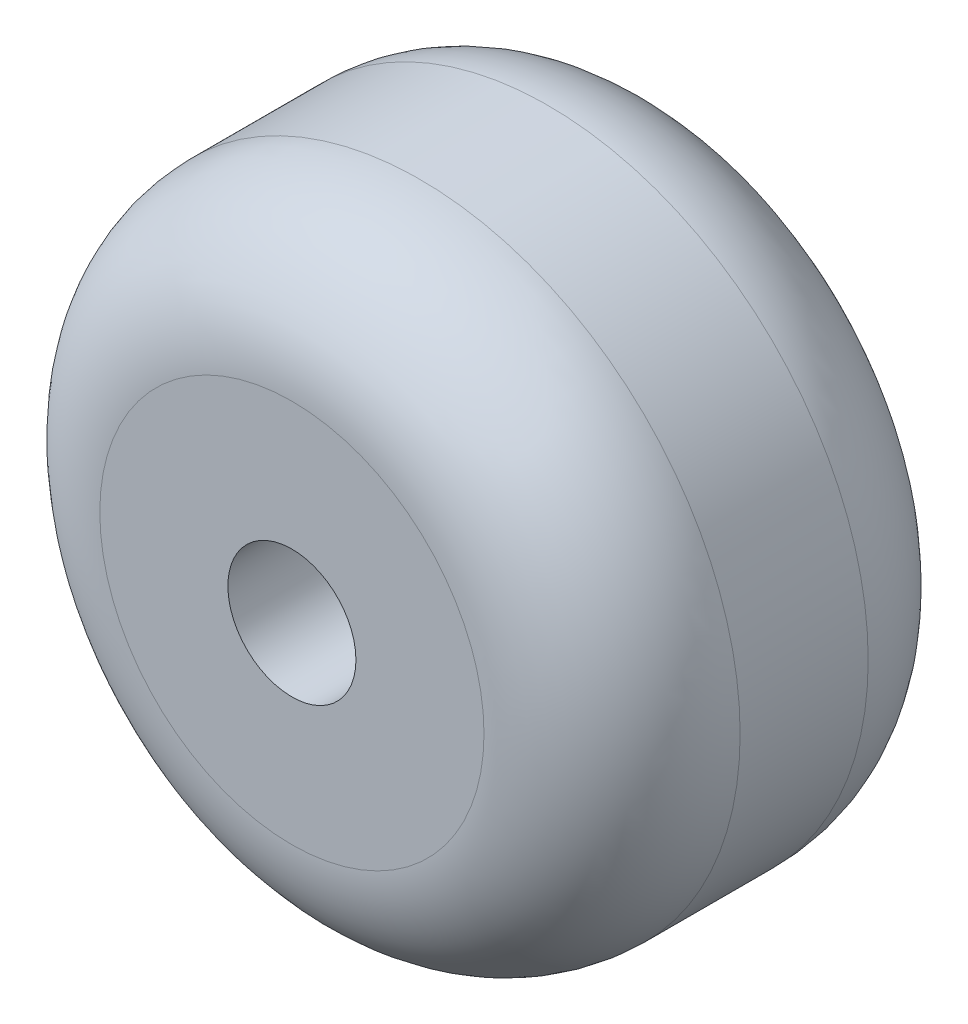
ISO-10303-21;
HEADER;
FILE_DESCRIPTION(('STEP AP214'),'2;1');
FILE_NAME('part.step','',(''),(''),'','','');
FILE_SCHEMA(('AUTOMOTIVE_DESIGN { 1 0 10303 214 1 1 1 1 }'));
ENDSEC;
DATA;
#1=APPLICATION_CONTEXT('core data for automotive mechanical design processes');
#2=APPLICATION_PROTOCOL_DEFINITION('international standard','automotive_design',2000,#1);
#3=PRODUCT_CONTEXT('',#1,'mechanical');
#4=PRODUCT('Part','Part','',(#3));
#5=PRODUCT_RELATED_PRODUCT_CATEGORY('part','',(#4));
#6=PRODUCT_DEFINITION_FORMATION('','',#4);
#7=PRODUCT_DEFINITION_CONTEXT('part definition',#1,'design');
#8=PRODUCT_DEFINITION('design','',#6,#7);
#9=PRODUCT_DEFINITION_SHAPE('','',#8);
#10=(LENGTH_UNIT() NAMED_UNIT(*) SI_UNIT(.MILLI.,.METRE.));
#11=(NAMED_UNIT(*) PLANE_ANGLE_UNIT() SI_UNIT($,.RADIAN.));
#12=(NAMED_UNIT(*) SI_UNIT($,.STERADIAN.) SOLID_ANGLE_UNIT());
#13=UNCERTAINTY_MEASURE_WITH_UNIT(LENGTH_MEASURE(1.E-05),#10,'distance_accuracy_value','');
#14=(GEOMETRIC_REPRESENTATION_CONTEXT(3) GLOBAL_UNCERTAINTY_ASSIGNED_CONTEXT((#13)) GLOBAL_UNIT_ASSIGNED_CONTEXT((#10,
#11,#12)) REPRESENTATION_CONTEXT('',''));
#15=CARTESIAN_POINT('',(0.,0.,0.));
#16=DIRECTION('',(0.,0.,1.));
#17=DIRECTION('',(1.,0.,0.));
#18=AXIS2_PLACEMENT_3D('',#15,#16,#17);
#19=CARTESIAN_POINT('',(0.,0.,30.));
#20=DIRECTION('',(0.,0.,1.));
#21=DIRECTION('',(1.,0.,0.));
#22=AXIS2_PLACEMENT_3D('',#19,#20,#21);
#23=PLANE('',#22);
#24=CARTESIAN_POINT('',(0.,0.,30.));
#25=DIRECTION('',(0.,0.,1.));
#26=DIRECTION('',(1.,0.,0.));
#27=AXIS2_PLACEMENT_3D('',#24,#25,#26);
#28=CIRCLE('',#27,15.);
#29=CARTESIAN_POINT('',(15.,0.,30.));
#30=VERTEX_POINT('',#29);
#31=EDGE_CURVE('E10',#30,#30,#28,.T.);
#32=ORIENTED_EDGE('',*,*,#31,.T.);
#33=EDGE_LOOP('',(#32));
#34=FACE_BOUND('',#33,.T.);
#35=CARTESIAN_POINT('',(0.,0.,30.));
#36=DIRECTION('',(0.,0.,1.));
#37=DIRECTION('',(1.,0.,0.));
#38=AXIS2_PLACEMENT_3D('',#35,#36,#37);
#39=CIRCLE('',#38,5.);
#40=CARTESIAN_POINT('',(5.,0.,30.));
#41=VERTEX_POINT('',#40);
#42=EDGE_CURVE('E61',#41,#41,#39,.T.);
#43=ORIENTED_EDGE('',*,*,#42,.F.);
#44=EDGE_LOOP('',(#43));
#45=FACE_BOUND('',#44,.T.);
#46=ADVANCED_FACE('F37',(#34,#45),#23,.T.);
#47=CARTESIAN_POINT('',(0.,0.,0.));
#48=DIRECTION('',(0.,0.,1.));
#49=DIRECTION('',(1.,0.,0.));
#50=AXIS2_PLACEMENT_3D('',#47,#48,#49);
#51=PLANE('',#50);
#52=CARTESIAN_POINT('',(0.,0.,0.));
#53=DIRECTION('',(0.,0.,1.));
#54=DIRECTION('',(1.,0.,0.));
#55=AXIS2_PLACEMENT_3D('',#52,#53,#54);
#56=CIRCLE('',#55,15.);
#57=CARTESIAN_POINT('',(15.,0.,0.));
#58=VERTEX_POINT('',#57);
#59=EDGE_CURVE('E45',#58,#58,#56,.F.);
#60=ORIENTED_EDGE('',*,*,#59,.T.);
#61=EDGE_LOOP('',(#60));
#62=FACE_BOUND('',#61,.T.);
#63=CARTESIAN_POINT('',(0.,0.,0.));
#64=DIRECTION('',(0.,0.,1.));
#65=DIRECTION('',(1.,0.,0.));
#66=AXIS2_PLACEMENT_3D('',#63,#64,#65);
#67=CIRCLE('',#66,5.);
#68=CARTESIAN_POINT('',(5.,0.,0.));
#69=VERTEX_POINT('',#68);
#70=EDGE_CURVE('E62',#69,#69,#67,.T.);
#71=ORIENTED_EDGE('',*,*,#70,.T.);
#72=EDGE_LOOP('',(#71));
#73=FACE_BOUND('',#72,.T.);
#74=ADVANCED_FACE('F74',(#62,#73),#51,.F.);
#75=CARTESIAN_POINT('',(0.,0.,30.));
#76=DIRECTION('',(0.,0.,-1.));
#77=DIRECTION('',(-1.,0.,0.));
#78=AXIS2_PLACEMENT_3D('',#75,#76,#77);
#79=CYLINDRICAL_SURFACE('',#78,25.);
#80=CARTESIAN_POINT('',(0.,0.,10.));
#81=DIRECTION('',(0.,0.,1.));
#82=DIRECTION('',(1.,0.,0.));
#83=AXIS2_PLACEMENT_3D('',#80,#81,#82);
#84=CIRCLE('',#83,25.);
#85=CARTESIAN_POINT('',(25.,0.,10.));
#86=VERTEX_POINT('',#85);
#87=EDGE_CURVE('E50',#86,#86,#84,.T.);
#88=ORIENTED_EDGE('',*,*,#87,.T.);
#89=EDGE_LOOP('',(#88));
#90=FACE_BOUND('',#89,.T.);
#91=CARTESIAN_POINT('',(0.,0.,20.));
#92=DIRECTION('',(0.,0.,1.));
#93=DIRECTION('',(1.,0.,0.));
#94=AXIS2_PLACEMENT_3D('',#91,#92,#93);
#95=CIRCLE('',#94,25.);
#96=CARTESIAN_POINT('',(25.,0.,20.));
#97=VERTEX_POINT('',#96);
#98=EDGE_CURVE('E55',#97,#97,#95,.F.);
#99=ORIENTED_EDGE('',*,*,#98,.T.);
#100=EDGE_LOOP('',(#99));
#101=FACE_BOUND('',#100,.T.);
#102=ADVANCED_FACE('F79',(#90,#101),#79,.T.);
#103=CARTESIAN_POINT('',(0.,0.,30.));
#104=DIRECTION('',(0.,0.,-1.));
#105=DIRECTION('',(-1.,0.,0.));
#106=AXIS2_PLACEMENT_3D('',#103,#104,#105);
#107=CYLINDRICAL_SURFACE('',#106,5.);
#108=ORIENTED_EDGE('',*,*,#42,.T.);
#109=EDGE_LOOP('',(#108));
#110=FACE_BOUND('',#109,.T.);
#111=ORIENTED_EDGE('',*,*,#70,.F.);
#112=EDGE_LOOP('',(#111));
#113=FACE_BOUND('',#112,.T.);
#114=ADVANCED_FACE('F70',(#110,#113),#107,.F.);
#115=CARTESIAN_POINT('',(0.,0.,10.));
#116=DIRECTION('',(0.,0.,1.));
#117=DIRECTION('',(1.,0.,0.));
#118=AXIS2_PLACEMENT_3D('',#115,#116,#117);
#119=TOROIDAL_SURFACE('',#118,15.,10.);
#120=ORIENTED_EDGE('',*,*,#59,.F.);
#121=EDGE_LOOP('',(#120));
#122=FACE_BOUND('',#121,.T.);
#123=ORIENTED_EDGE('',*,*,#87,.F.);
#124=EDGE_LOOP('',(#123));
#125=FACE_BOUND('',#124,.T.);
#126=ADVANCED_FACE('F85',(#122,#125),#119,.T.);
#127=CARTESIAN_POINT('',(0.,0.,20.));
#128=DIRECTION('',(0.,0.,1.));
#129=DIRECTION('',(1.,0.,0.));
#130=AXIS2_PLACEMENT_3D('',#127,#128,#129);
#131=TOROIDAL_SURFACE('',#130,15.,10.);
#132=ORIENTED_EDGE('',*,*,#98,.F.);
#133=EDGE_LOOP('',(#132));
#134=FACE_BOUND('',#133,.T.);
#135=ORIENTED_EDGE('',*,*,#31,.F.);
#136=EDGE_LOOP('',(#135));
#137=FACE_BOUND('',#136,.T.);
#138=ADVANCED_FACE('F39',(#134,#137),#131,.T.);
#139=CLOSED_SHELL('',(#46,#74,#102,#114,#126,#138));
#140=MANIFOLD_SOLID_BREP('B2',#139);
#141=ADVANCED_BREP_SHAPE_REPRESENTATION('',(#18,#140),#14);
#142=SHAPE_DEFINITION_REPRESENTATION(#9,#141);
ENDSEC;
END-ISO-10303-21;
